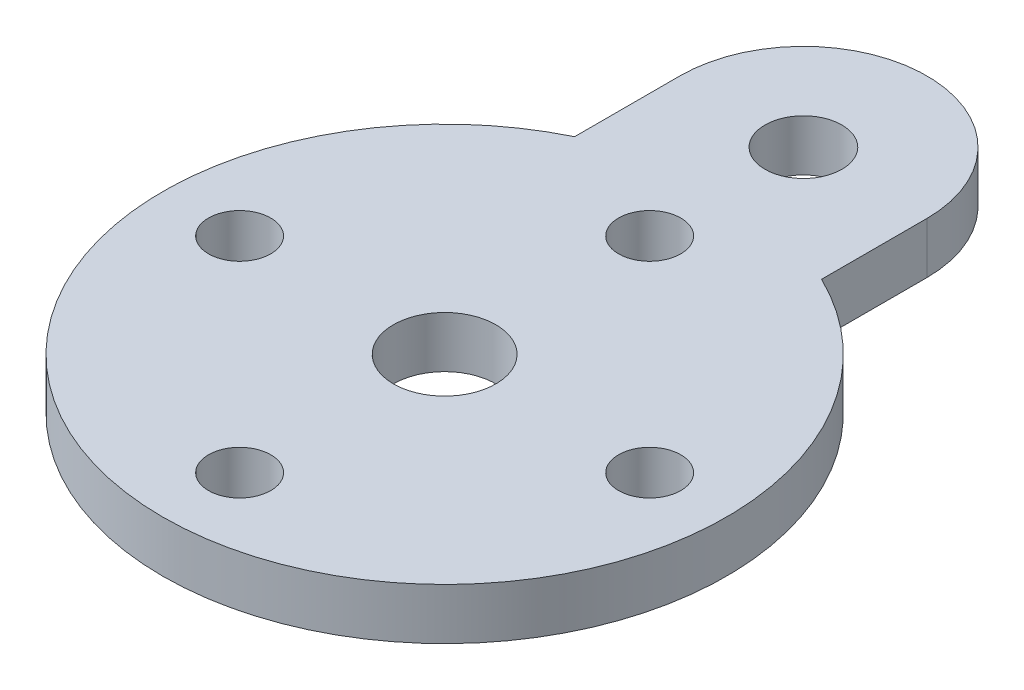
ISO-10303-21;
HEADER;
FILE_DESCRIPTION(('STEP AP214'),'2;1');
FILE_NAME('part.step','',(''),(''),'','','');
FILE_SCHEMA(('AUTOMOTIVE_DESIGN { 1 0 10303 214 1 1 1 1 }'));
ENDSEC;
DATA;
#1=APPLICATION_CONTEXT('core data for automotive mechanical design processes');
#2=APPLICATION_PROTOCOL_DEFINITION('international standard','automotive_design',2000,#1);
#3=PRODUCT_CONTEXT('',#1,'mechanical');
#4=PRODUCT('Part','Part','',(#3));
#5=PRODUCT_RELATED_PRODUCT_CATEGORY('part','',(#4));
#6=PRODUCT_DEFINITION_FORMATION('','',#4);
#7=PRODUCT_DEFINITION_CONTEXT('part definition',#1,'design');
#8=PRODUCT_DEFINITION('design','',#6,#7);
#9=PRODUCT_DEFINITION_SHAPE('','',#8);
#10=(LENGTH_UNIT() NAMED_UNIT(*) SI_UNIT(.MILLI.,.METRE.));
#11=(NAMED_UNIT(*) PLANE_ANGLE_UNIT() SI_UNIT($,.RADIAN.));
#12=(NAMED_UNIT(*) SI_UNIT($,.STERADIAN.) SOLID_ANGLE_UNIT());
#13=UNCERTAINTY_MEASURE_WITH_UNIT(LENGTH_MEASURE(1.E-05),#10,'distance_accuracy_value','');
#14=(GEOMETRIC_REPRESENTATION_CONTEXT(3) GLOBAL_UNCERTAINTY_ASSIGNED_CONTEXT((#13)) GLOBAL_UNIT_ASSIGNED_CONTEXT((#10,
#11,#12)) REPRESENTATION_CONTEXT('',''));
#15=CARTESIAN_POINT('',(0.,0.,0.));
#16=DIRECTION('',(0.,0.,1.));
#17=DIRECTION('',(1.,0.,0.));
#18=AXIS2_PLACEMENT_3D('',#15,#16,#17);
#19=CARTESIAN_POINT('',(0.,2.,-14.));
#20=DIRECTION('',(0.,-1.,0.));
#21=DIRECTION('',(0.,0.,-1.));
#22=AXIS2_PLACEMENT_3D('',#19,#20,#21);
#23=PLANE('',#22);
#24=CARTESIAN_POINT('',(-7.99999999999977,2.,2.27373675443232E-13));
#25=DIRECTION('',(0.,1.,0.));
#26=DIRECTION('',(0.,0.,1.));
#27=AXIS2_PLACEMENT_3D('',#24,#25,#26);
#28=CIRCLE('',#27,1.21340271094826);
#29=CARTESIAN_POINT('',(-7.99999999999977,2.,1.21340271094849));
#30=VERTEX_POINT('',#29);
#31=EDGE_CURVE('E135',#30,#30,#28,.T.);
#32=ORIENTED_EDGE('',*,*,#31,.F.);
#33=EDGE_LOOP('',(#32));
#34=FACE_BOUND('',#33,.T.);
#35=CARTESIAN_POINT('',(8.00000000000023,2.,-2.26393958003914E-13));
#36=DIRECTION('',(0.,1.,0.));
#37=DIRECTION('',(0.,0.,1.));
#38=AXIS2_PLACEMENT_3D('',#35,#36,#37);
#39=CIRCLE('',#38,1.21340271094808);
#40=CARTESIAN_POINT('',(8.00000000000023,2.,1.21340271094785));
#41=VERTEX_POINT('',#40);
#42=EDGE_CURVE('E123',#41,#41,#39,.T.);
#43=ORIENTED_EDGE('',*,*,#42,.F.);
#44=EDGE_LOOP('',(#43));
#45=FACE_BOUND('',#44,.T.);
#46=CARTESIAN_POINT('',(0.,2.,-8.));
#47=DIRECTION('',(0.,1.,0.));
#48=DIRECTION('',(0.,0.,1.));
#49=AXIS2_PLACEMENT_3D('',#46,#47,#48);
#50=CIRCLE('',#49,1.2134027109479);
#51=CARTESIAN_POINT('',(0.,2.,-6.7865972890521));
#52=VERTEX_POINT('',#51);
#53=EDGE_CURVE('E102',#52,#52,#50,.T.);
#54=ORIENTED_EDGE('',*,*,#53,.F.);
#55=EDGE_LOOP('',(#54));
#56=FACE_BOUND('',#55,.T.);
#57=CARTESIAN_POINT('',(0.,2.,-14.));
#58=DIRECTION('',(0.,1.,0.));
#59=DIRECTION('',(0.,0.,-1.));
#60=AXIS2_PLACEMENT_3D('',#57,#58,#59);
#61=CIRCLE('',#60,4.81810640195146);
#62=CARTESIAN_POINT('',(4.81810640195146,2.,-14.));
#63=VERTEX_POINT('',#62);
#64=CARTESIAN_POINT('',(-4.81810640195146,2.,-14.));
#65=VERTEX_POINT('',#64);
#66=EDGE_CURVE('E87',#63,#65,#61,.T.);
#67=ORIENTED_EDGE('',*,*,#66,.T.);
#68=DIRECTION('',(0.,0.,1.));
#69=VECTOR('',#68,1.);
#70=CARTESIAN_POINT('',(-4.81810640195146,2.,-14.));
#71=LINE('',#70,#69);
#72=CARTESIAN_POINT('',(-4.81810640195146,2.,-9.88867284823774));
#73=VERTEX_POINT('',#72);
#74=EDGE_CURVE('E82',#65,#73,#71,.T.);
#75=ORIENTED_EDGE('',*,*,#74,.T.);
#76=CARTESIAN_POINT('',(0.,2.,0.));
#77=DIRECTION('',(0.,1.,0.));
#78=DIRECTION('',(0.,0.,1.));
#79=AXIS2_PLACEMENT_3D('',#76,#77,#78);
#80=CIRCLE('',#79,11.);
#81=CARTESIAN_POINT('',(4.81810640195146,2.,-9.88867284823774));
#82=VERTEX_POINT('',#81);
#83=EDGE_CURVE('E85',#73,#82,#80,.T.);
#84=ORIENTED_EDGE('',*,*,#83,.T.);
#85=DIRECTION('',(0.,0.,-1.));
#86=VECTOR('',#85,1.);
#87=CARTESIAN_POINT('',(4.81810640195146,2.,-14.));
#88=LINE('',#87,#86);
#89=EDGE_CURVE('E52',#82,#63,#88,.T.);
#90=ORIENTED_EDGE('',*,*,#89,.T.);
#91=EDGE_LOOP('',(#67,#75,#84,#90));
#92=FACE_BOUND('',#91,.T.);
#93=CARTESIAN_POINT('',(0.,2.,0.));
#94=DIRECTION('',(0.,1.,0.));
#95=DIRECTION('',(0.,0.,1.));
#96=AXIS2_PLACEMENT_3D('',#93,#94,#95);
#97=CIRCLE('',#96,2.);
#98=CARTESIAN_POINT('',(0.,2.,2.));
#99=VERTEX_POINT('',#98);
#100=EDGE_CURVE('E117',#99,#99,#97,.T.);
#101=ORIENTED_EDGE('',*,*,#100,.F.);
#102=EDGE_LOOP('',(#101));
#103=FACE_BOUND('',#102,.T.);
#104=CARTESIAN_POINT('',(4.52787916007828E-13,2.,8.));
#105=DIRECTION('',(0.,1.,0.));
#106=DIRECTION('',(0.,0.,1.));
#107=AXIS2_PLACEMENT_3D('',#104,#105,#106);
#108=CIRCLE('',#107,1.21340271094839);
#109=CARTESIAN_POINT('',(4.52787916007828E-13,2.,9.21340271094839));
#110=VERTEX_POINT('',#109);
#111=EDGE_CURVE('E129',#110,#110,#108,.T.);
#112=ORIENTED_EDGE('',*,*,#111,.F.);
#113=EDGE_LOOP('',(#112));
#114=FACE_BOUND('',#113,.T.);
#115=CARTESIAN_POINT('',(0.,2.,-14.));
#116=DIRECTION('',(0.,1.,0.));
#117=DIRECTION('',(0.,0.,1.));
#118=AXIS2_PLACEMENT_3D('',#115,#116,#117);
#119=CIRCLE('',#118,1.5);
#120=CARTESIAN_POINT('',(0.,2.,-12.5));
#121=VERTEX_POINT('',#120);
#122=EDGE_CURVE('E141',#121,#121,#119,.T.);
#123=ORIENTED_EDGE('',*,*,#122,.F.);
#124=EDGE_LOOP('',(#123));
#125=FACE_BOUND('',#124,.T.);
#126=ADVANCED_FACE('F35',(#34,#45,#56,#92,#103,#114,#125),#23,.F.);
#127=CARTESIAN_POINT('',(0.,0.,-14.));
#128=DIRECTION('',(0.,-1.,0.));
#129=DIRECTION('',(0.,0.,-1.));
#130=AXIS2_PLACEMENT_3D('',#127,#128,#129);
#131=PLANE('',#130);
#132=CARTESIAN_POINT('',(-7.99999999999977,0.,2.27373675443232E-13));
#133=DIRECTION('',(0.,1.,0.));
#134=DIRECTION('',(0.,0.,1.));
#135=AXIS2_PLACEMENT_3D('',#132,#133,#134);
#136=CIRCLE('',#135,1.21340271094826);
#137=CARTESIAN_POINT('',(-7.99999999999977,0.,1.21340271094849));
#138=VERTEX_POINT('',#137);
#139=EDGE_CURVE('E138',#138,#138,#136,.T.);
#140=ORIENTED_EDGE('',*,*,#139,.T.);
#141=EDGE_LOOP('',(#140));
#142=FACE_BOUND('',#141,.T.);
#143=CARTESIAN_POINT('',(8.00000000000023,0.,-2.26393958003914E-13));
#144=DIRECTION('',(0.,1.,0.));
#145=DIRECTION('',(0.,0.,1.));
#146=AXIS2_PLACEMENT_3D('',#143,#144,#145);
#147=CIRCLE('',#146,1.21340271094808);
#148=CARTESIAN_POINT('',(8.00000000000023,0.,1.21340271094785));
#149=VERTEX_POINT('',#148);
#150=EDGE_CURVE('E126',#149,#149,#147,.T.);
#151=ORIENTED_EDGE('',*,*,#150,.T.);
#152=EDGE_LOOP('',(#151));
#153=FACE_BOUND('',#152,.T.);
#154=CARTESIAN_POINT('',(0.,0.,-8.));
#155=DIRECTION('',(0.,1.,0.));
#156=DIRECTION('',(0.,0.,1.));
#157=AXIS2_PLACEMENT_3D('',#154,#155,#156);
#158=CIRCLE('',#157,1.2134027109479);
#159=CARTESIAN_POINT('',(0.,0.,-6.7865972890521));
#160=VERTEX_POINT('',#159);
#161=EDGE_CURVE('E114',#160,#160,#158,.T.);
#162=ORIENTED_EDGE('',*,*,#161,.T.);
#163=EDGE_LOOP('',(#162));
#164=FACE_BOUND('',#163,.T.);
#165=CARTESIAN_POINT('',(0.,0.,-14.));
#166=DIRECTION('',(0.,1.,0.));
#167=DIRECTION('',(0.,0.,-1.));
#168=AXIS2_PLACEMENT_3D('',#165,#166,#167);
#169=CIRCLE('',#168,4.81810640195146);
#170=CARTESIAN_POINT('',(4.81810640195146,0.,-14.));
#171=VERTEX_POINT('',#170);
#172=CARTESIAN_POINT('',(-4.81810640195146,0.,-14.));
#173=VERTEX_POINT('',#172);
#174=EDGE_CURVE('E99',#171,#173,#169,.T.);
#175=ORIENTED_EDGE('',*,*,#174,.F.);
#176=DIRECTION('',(0.,0.,-1.));
#177=VECTOR('',#176,1.);
#178=CARTESIAN_POINT('',(4.81810640195146,0.,-14.));
#179=LINE('',#178,#177);
#180=CARTESIAN_POINT('',(4.81810640195146,0.,-9.88867284823774));
#181=VERTEX_POINT('',#180);
#182=EDGE_CURVE('E75',#181,#171,#179,.T.);
#183=ORIENTED_EDGE('',*,*,#182,.F.);
#184=CARTESIAN_POINT('',(0.,0.,0.));
#185=DIRECTION('',(0.,1.,0.));
#186=DIRECTION('',(0.,0.,1.));
#187=AXIS2_PLACEMENT_3D('',#184,#185,#186);
#188=CIRCLE('',#187,11.);
#189=CARTESIAN_POINT('',(-4.81810640195146,0.,-9.88867284823774));
#190=VERTEX_POINT('',#189);
#191=EDGE_CURVE('E69',#190,#181,#188,.T.);
#192=ORIENTED_EDGE('',*,*,#191,.F.);
#193=DIRECTION('',(0.,0.,1.));
#194=VECTOR('',#193,1.);
#195=CARTESIAN_POINT('',(-4.81810640195146,0.,-14.));
#196=LINE('',#195,#194);
#197=EDGE_CURVE('E91',#173,#190,#196,.T.);
#198=ORIENTED_EDGE('',*,*,#197,.F.);
#199=EDGE_LOOP('',(#175,#183,#192,#198));
#200=FACE_BOUND('',#199,.T.);
#201=CARTESIAN_POINT('',(0.,0.,0.));
#202=DIRECTION('',(0.,1.,0.));
#203=DIRECTION('',(0.,0.,1.));
#204=AXIS2_PLACEMENT_3D('',#201,#202,#203);
#205=CIRCLE('',#204,2.);
#206=CARTESIAN_POINT('',(0.,0.,2.));
#207=VERTEX_POINT('',#206);
#208=EDGE_CURVE('E120',#207,#207,#205,.T.);
#209=ORIENTED_EDGE('',*,*,#208,.T.);
#210=EDGE_LOOP('',(#209));
#211=FACE_BOUND('',#210,.T.);
#212=CARTESIAN_POINT('',(4.52787916007828E-13,0.,8.));
#213=DIRECTION('',(0.,1.,0.));
#214=DIRECTION('',(0.,0.,1.));
#215=AXIS2_PLACEMENT_3D('',#212,#213,#214);
#216=CIRCLE('',#215,1.21340271094839);
#217=CARTESIAN_POINT('',(4.52787916007828E-13,0.,9.21340271094839));
#218=VERTEX_POINT('',#217);
#219=EDGE_CURVE('E132',#218,#218,#216,.T.);
#220=ORIENTED_EDGE('',*,*,#219,.T.);
#221=EDGE_LOOP('',(#220));
#222=FACE_BOUND('',#221,.T.);
#223=CARTESIAN_POINT('',(0.,0.,-14.));
#224=DIRECTION('',(0.,1.,0.));
#225=DIRECTION('',(0.,0.,1.));
#226=AXIS2_PLACEMENT_3D('',#223,#224,#225);
#227=CIRCLE('',#226,1.5);
#228=CARTESIAN_POINT('',(0.,0.,-12.5));
#229=VERTEX_POINT('',#228);
#230=EDGE_CURVE('E144',#229,#229,#227,.T.);
#231=ORIENTED_EDGE('',*,*,#230,.T.);
#232=EDGE_LOOP('',(#231));
#233=FACE_BOUND('',#232,.T.);
#234=ADVANCED_FACE('F110',(#142,#153,#164,#200,#211,#222,#233),#131,.T.);
#235=CARTESIAN_POINT('',(0.,2.,-14.));
#236=DIRECTION('',(0.,-1.,0.));
#237=DIRECTION('',(0.,0.,-1.));
#238=AXIS2_PLACEMENT_3D('',#235,#236,#237);
#239=CYLINDRICAL_SURFACE('',#238,4.81810640195146);
#240=ORIENTED_EDGE('',*,*,#174,.T.);
#241=DIRECTION('',(0.,-1.,0.));
#242=VECTOR('',#241,1.);
#243=CARTESIAN_POINT('',(-4.81810640195146,2.,-14.));
#244=LINE('',#243,#242);
#245=EDGE_CURVE('E11',#65,#173,#244,.T.);
#246=ORIENTED_EDGE('',*,*,#245,.F.);
#247=ORIENTED_EDGE('',*,*,#66,.F.);
#248=DIRECTION('',(0.,-1.,0.));
#249=VECTOR('',#248,1.);
#250=CARTESIAN_POINT('',(4.81810640195146,2.,-14.));
#251=LINE('',#250,#249);
#252=EDGE_CURVE('E95',#63,#171,#251,.T.);
#253=ORIENTED_EDGE('',*,*,#252,.T.);
#254=EDGE_LOOP('',(#240,#246,#247,#253));
#255=FACE_BOUND('',#254,.T.);
#256=ADVANCED_FACE('F37',(#255),#239,.T.);
#257=CARTESIAN_POINT('',(-4.81810640195146,2.,-14.));
#258=DIRECTION('',(1.,0.,0.));
#259=DIRECTION('',(0.,0.,-1.));
#260=AXIS2_PLACEMENT_3D('',#257,#258,#259);
#261=PLANE('',#260);
#262=ORIENTED_EDGE('',*,*,#197,.T.);
#263=DIRECTION('',(0.,-1.,0.));
#264=VECTOR('',#263,1.);
#265=CARTESIAN_POINT('',(-4.81810640195146,2.,-9.88867284823774));
#266=LINE('',#265,#264);
#267=EDGE_CURVE('E44',#73,#190,#266,.T.);
#268=ORIENTED_EDGE('',*,*,#267,.F.);
#269=ORIENTED_EDGE('',*,*,#74,.F.);
#270=ORIENTED_EDGE('',*,*,#245,.T.);
#271=EDGE_LOOP('',(#262,#268,#269,#270));
#272=FACE_BOUND('',#271,.T.);
#273=ADVANCED_FACE('F90',(#272),#261,.F.);
#274=CARTESIAN_POINT('',(0.,2.,0.));
#275=DIRECTION('',(0.,-1.,0.));
#276=DIRECTION('',(0.,0.,-1.));
#277=AXIS2_PLACEMENT_3D('',#274,#275,#276);
#278=CYLINDRICAL_SURFACE('',#277,11.);
#279=ORIENTED_EDGE('',*,*,#191,.T.);
#280=DIRECTION('',(0.,-1.,0.));
#281=VECTOR('',#280,1.);
#282=CARTESIAN_POINT('',(4.81810640195146,2.,-9.88867284823774));
#283=LINE('',#282,#281);
#284=EDGE_CURVE('E92',#82,#181,#283,.T.);
#285=ORIENTED_EDGE('',*,*,#284,.F.);
#286=ORIENTED_EDGE('',*,*,#83,.F.);
#287=ORIENTED_EDGE('',*,*,#267,.T.);
#288=EDGE_LOOP('',(#279,#285,#286,#287));
#289=FACE_BOUND('',#288,.T.);
#290=ADVANCED_FACE('F93',(#289),#278,.T.);
#291=CARTESIAN_POINT('',(4.81810640195146,2.,-14.));
#292=DIRECTION('',(-1.,0.,0.));
#293=DIRECTION('',(0.,0.,1.));
#294=AXIS2_PLACEMENT_3D('',#291,#292,#293);
#295=PLANE('',#294);
#296=ORIENTED_EDGE('',*,*,#182,.T.);
#297=ORIENTED_EDGE('',*,*,#252,.F.);
#298=ORIENTED_EDGE('',*,*,#89,.F.);
#299=ORIENTED_EDGE('',*,*,#284,.T.);
#300=EDGE_LOOP('',(#296,#297,#298,#299));
#301=FACE_BOUND('',#300,.T.);
#302=ADVANCED_FACE('F107',(#301),#295,.F.);
#303=CARTESIAN_POINT('',(0.,2.,-8.));
#304=DIRECTION('',(0.,-1.,0.));
#305=DIRECTION('',(0.,0.,-1.));
#306=AXIS2_PLACEMENT_3D('',#303,#304,#305);
#307=CYLINDRICAL_SURFACE('',#306,1.2134027109479);
#308=ORIENTED_EDGE('',*,*,#53,.T.);
#309=EDGE_LOOP('',(#308));
#310=FACE_BOUND('',#309,.T.);
#311=ORIENTED_EDGE('',*,*,#161,.F.);
#312=EDGE_LOOP('',(#311));
#313=FACE_BOUND('',#312,.T.);
#314=ADVANCED_FACE('F164',(#310,#313),#307,.F.);
#315=CARTESIAN_POINT('',(0.,2.,0.));
#316=DIRECTION('',(0.,-1.,0.));
#317=DIRECTION('',(0.,0.,-1.));
#318=AXIS2_PLACEMENT_3D('',#315,#316,#317);
#319=CYLINDRICAL_SURFACE('',#318,2.);
#320=ORIENTED_EDGE('',*,*,#100,.T.);
#321=EDGE_LOOP('',(#320));
#322=FACE_BOUND('',#321,.T.);
#323=ORIENTED_EDGE('',*,*,#208,.F.);
#324=EDGE_LOOP('',(#323));
#325=FACE_BOUND('',#324,.T.);
#326=ADVANCED_FACE('F210',(#322,#325),#319,.F.);
#327=CARTESIAN_POINT('',(8.00000000000023,2.,-2.26393958003914E-13));
#328=DIRECTION('',(0.,-1.,0.));
#329=DIRECTION('',(0.,0.,-1.));
#330=AXIS2_PLACEMENT_3D('',#327,#328,#329);
#331=CYLINDRICAL_SURFACE('',#330,1.21340271094808);
#332=ORIENTED_EDGE('',*,*,#42,.T.);
#333=EDGE_LOOP('',(#332));
#334=FACE_BOUND('',#333,.T.);
#335=ORIENTED_EDGE('',*,*,#150,.F.);
#336=EDGE_LOOP('',(#335));
#337=FACE_BOUND('',#336,.T.);
#338=ADVANCED_FACE('F218',(#334,#337),#331,.F.);
#339=CARTESIAN_POINT('',(4.52787916007828E-13,2.,8.));
#340=DIRECTION('',(0.,-1.,0.));
#341=DIRECTION('',(0.,0.,-1.));
#342=AXIS2_PLACEMENT_3D('',#339,#340,#341);
#343=CYLINDRICAL_SURFACE('',#342,1.21340271094839);
#344=ORIENTED_EDGE('',*,*,#111,.T.);
#345=EDGE_LOOP('',(#344));
#346=FACE_BOUND('',#345,.T.);
#347=ORIENTED_EDGE('',*,*,#219,.F.);
#348=EDGE_LOOP('',(#347));
#349=FACE_BOUND('',#348,.T.);
#350=ADVANCED_FACE('F226',(#346,#349),#343,.F.);
#351=CARTESIAN_POINT('',(-7.99999999999977,2.,2.27373675443232E-13));
#352=DIRECTION('',(0.,-1.,0.));
#353=DIRECTION('',(0.,0.,-1.));
#354=AXIS2_PLACEMENT_3D('',#351,#352,#353);
#355=CYLINDRICAL_SURFACE('',#354,1.21340271094826);
#356=ORIENTED_EDGE('',*,*,#31,.T.);
#357=EDGE_LOOP('',(#356));
#358=FACE_BOUND('',#357,.T.);
#359=ORIENTED_EDGE('',*,*,#139,.F.);
#360=EDGE_LOOP('',(#359));
#361=FACE_BOUND('',#360,.T.);
#362=ADVANCED_FACE('F235',(#358,#361),#355,.F.);
#363=CARTESIAN_POINT('',(0.,2.,-14.));
#364=DIRECTION('',(0.,-1.,0.));
#365=DIRECTION('',(0.,0.,-1.));
#366=AXIS2_PLACEMENT_3D('',#363,#364,#365);
#367=CYLINDRICAL_SURFACE('',#366,1.5);
#368=ORIENTED_EDGE('',*,*,#122,.T.);
#369=EDGE_LOOP('',(#368));
#370=FACE_BOUND('',#369,.T.);
#371=ORIENTED_EDGE('',*,*,#230,.F.);
#372=EDGE_LOOP('',(#371));
#373=FACE_BOUND('',#372,.T.);
#374=ADVANCED_FACE('F150',(#370,#373),#367,.F.);
#375=CLOSED_SHELL('',(#126,#234,#256,#273,#290,#302,#314,#326,#338,#350,#362,#374));
#376=MANIFOLD_SOLID_BREP('B2',#375);
#377=ADVANCED_BREP_SHAPE_REPRESENTATION('',(#18,#376),#14);
#378=SHAPE_DEFINITION_REPRESENTATION(#9,#377);
ENDSEC;
END-ISO-10303-21;
